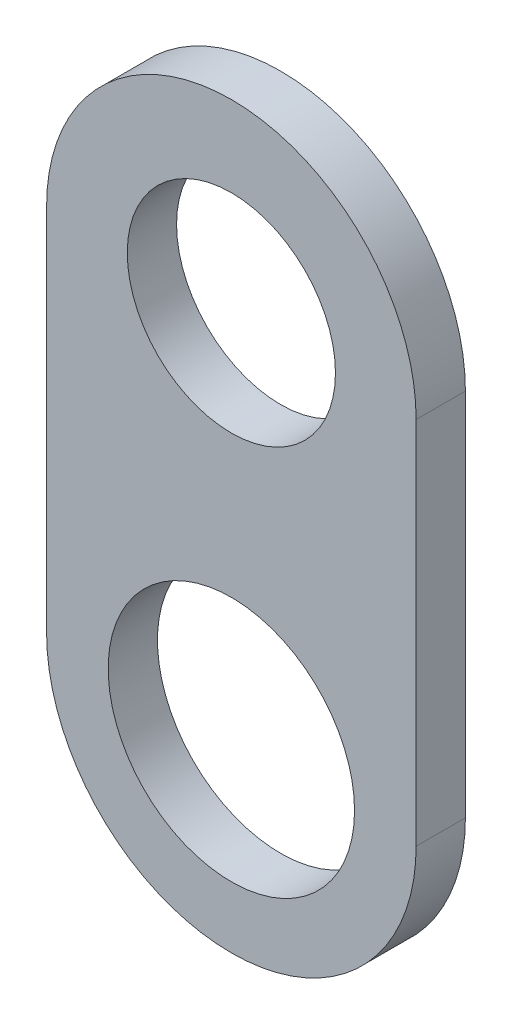
ISO-10303-21;
HEADER;
FILE_DESCRIPTION(('STEP AP214'),'2;1');
FILE_NAME('part.step','',(''),(''),'','','');
FILE_SCHEMA(('AUTOMOTIVE_DESIGN { 1 0 10303 214 1 1 1 1 }'));
ENDSEC;
DATA;
#1=APPLICATION_CONTEXT('core data for automotive mechanical design processes');
#2=APPLICATION_PROTOCOL_DEFINITION('international standard','automotive_design',2000,#1);
#3=PRODUCT_CONTEXT('',#1,'mechanical');
#4=PRODUCT('Part','Part','',(#3));
#5=PRODUCT_RELATED_PRODUCT_CATEGORY('part','',(#4));
#6=PRODUCT_DEFINITION_FORMATION('','',#4);
#7=PRODUCT_DEFINITION_CONTEXT('part definition',#1,'design');
#8=PRODUCT_DEFINITION('design','',#6,#7);
#9=PRODUCT_DEFINITION_SHAPE('','',#8);
#10=(LENGTH_UNIT() NAMED_UNIT(*) SI_UNIT(.MILLI.,.METRE.));
#11=(NAMED_UNIT(*) PLANE_ANGLE_UNIT() SI_UNIT($,.RADIAN.));
#12=(NAMED_UNIT(*) SI_UNIT($,.STERADIAN.) SOLID_ANGLE_UNIT());
#13=UNCERTAINTY_MEASURE_WITH_UNIT(LENGTH_MEASURE(1.E-05),#10,'distance_accuracy_value','');
#14=(GEOMETRIC_REPRESENTATION_CONTEXT(3) GLOBAL_UNCERTAINTY_ASSIGNED_CONTEXT((#13)) GLOBAL_UNIT_ASSIGNED_CONTEXT((#10,
#11,#12)) REPRESENTATION_CONTEXT('',''));
#15=CARTESIAN_POINT('',(0.,0.,0.));
#16=DIRECTION('',(0.,0.,1.));
#17=DIRECTION('',(1.,0.,0.));
#18=AXIS2_PLACEMENT_3D('',#15,#16,#17);
#19=CARTESIAN_POINT('',(0.,-38.1,5.08));
#20=DIRECTION('',(0.,0.,1.));
#21=DIRECTION('',(1.,0.,0.));
#22=AXIS2_PLACEMENT_3D('',#19,#20,#21);
#23=PLANE('',#22);
#24=CARTESIAN_POINT('',(0.,0.,5.08));
#25=DIRECTION('',(0.,0.,1.));
#26=DIRECTION('',(1.,0.,0.));
#27=AXIS2_PLACEMENT_3D('',#24,#25,#26);
#28=CIRCLE('',#27,10.7315);
#29=CARTESIAN_POINT('',(10.7315,0.,5.08));
#30=VERTEX_POINT('',#29);
#31=EDGE_CURVE('E131',#30,#30,#28,.T.);
#32=ORIENTED_EDGE('',*,*,#31,.F.);
#33=EDGE_LOOP('',(#32));
#34=FACE_BOUND('',#33,.T.);
#35=CARTESIAN_POINT('',(0.,-38.1,5.08));
#36=DIRECTION('',(0.,0.,1.));
#37=DIRECTION('',(1.,0.,0.));
#38=AXIS2_PLACEMENT_3D('',#35,#36,#37);
#39=CIRCLE('',#38,19.05);
#40=CARTESIAN_POINT('',(-19.05,-38.1,5.08));
#41=VERTEX_POINT('',#40);
#42=CARTESIAN_POINT('',(19.05,-38.1,5.08));
#43=VERTEX_POINT('',#42);
#44=EDGE_CURVE('E107',#41,#43,#39,.T.);
#45=ORIENTED_EDGE('',*,*,#44,.T.);
#46=DIRECTION('',(0.,1.,0.));
#47=VECTOR('',#46,1.);
#48=CARTESIAN_POINT('',(19.05,-38.1,5.08));
#49=LINE('',#48,#47);
#50=CARTESIAN_POINT('',(19.05,0.,5.08));
#51=VERTEX_POINT('',#50);
#52=EDGE_CURVE('E103',#43,#51,#49,.T.);
#53=ORIENTED_EDGE('',*,*,#52,.T.);
#54=CARTESIAN_POINT('',(0.,0.,5.08));
#55=DIRECTION('',(0.,0.,1.));
#56=DIRECTION('',(1.,0.,0.));
#57=AXIS2_PLACEMENT_3D('',#54,#55,#56);
#58=CIRCLE('',#57,19.05);
#59=CARTESIAN_POINT('',(-19.05,0.,5.08));
#60=VERTEX_POINT('',#59);
#61=EDGE_CURVE('E106',#51,#60,#58,.T.);
#62=ORIENTED_EDGE('',*,*,#61,.T.);
#63=DIRECTION('',(0.,-1.,0.));
#64=VECTOR('',#63,1.);
#65=CARTESIAN_POINT('',(-19.05,-38.1,5.08));
#66=LINE('',#65,#64);
#67=EDGE_CURVE('E75',#60,#41,#66,.T.);
#68=ORIENTED_EDGE('',*,*,#67,.T.);
#69=EDGE_LOOP('',(#45,#53,#62,#68));
#70=FACE_BOUND('',#69,.T.);
#71=CARTESIAN_POINT('',(0.,-38.1,5.08));
#72=DIRECTION('',(0.,0.,1.));
#73=DIRECTION('',(1.,0.,0.));
#74=AXIS2_PLACEMENT_3D('',#71,#72,#73);
#75=CIRCLE('',#74,12.7);
#76=CARTESIAN_POINT('',(12.7,-38.1,5.08));
#77=VERTEX_POINT('',#76);
#78=EDGE_CURVE('E152',#77,#77,#75,.T.);
#79=ORIENTED_EDGE('',*,*,#78,.F.);
#80=EDGE_LOOP('',(#79));
#81=FACE_BOUND('',#80,.T.);
#82=ADVANCED_FACE('F60',(#34,#70,#81),#23,.T.);
#83=CARTESIAN_POINT('',(0.,-38.1,0.));
#84=DIRECTION('',(0.,0.,1.));
#85=DIRECTION('',(1.,0.,0.));
#86=AXIS2_PLACEMENT_3D('',#83,#84,#85);
#87=PLANE('',#86);
#88=CARTESIAN_POINT('',(0.,-38.1,0.));
#89=DIRECTION('',(0.,0.,1.));
#90=DIRECTION('',(1.,0.,0.));
#91=AXIS2_PLACEMENT_3D('',#88,#89,#90);
#92=CIRCLE('',#91,19.05);
#93=CARTESIAN_POINT('',(-19.05,-38.1,0.));
#94=VERTEX_POINT('',#93);
#95=CARTESIAN_POINT('',(19.05,-38.1,0.));
#96=VERTEX_POINT('',#95);
#97=EDGE_CURVE('E130',#94,#96,#92,.T.);
#98=ORIENTED_EDGE('',*,*,#97,.F.);
#99=DIRECTION('',(0.,-1.,0.));
#100=VECTOR('',#99,1.);
#101=CARTESIAN_POINT('',(-19.05,-38.1,0.));
#102=LINE('',#101,#100);
#103=CARTESIAN_POINT('',(-19.05,0.,0.));
#104=VERTEX_POINT('',#103);
#105=EDGE_CURVE('E97',#104,#94,#102,.T.);
#106=ORIENTED_EDGE('',*,*,#105,.F.);
#107=CARTESIAN_POINT('',(0.,0.,0.));
#108=DIRECTION('',(0.,0.,1.));
#109=DIRECTION('',(1.,0.,0.));
#110=AXIS2_PLACEMENT_3D('',#107,#108,#109);
#111=CIRCLE('',#110,19.05);
#112=CARTESIAN_POINT('',(19.05,0.,0.));
#113=VERTEX_POINT('',#112);
#114=EDGE_CURVE('E95',#113,#104,#111,.T.);
#115=ORIENTED_EDGE('',*,*,#114,.F.);
#116=DIRECTION('',(0.,1.,0.));
#117=VECTOR('',#116,1.);
#118=CARTESIAN_POINT('',(19.05,-38.1,0.));
#119=LINE('',#118,#117);
#120=EDGE_CURVE('E113',#96,#113,#119,.T.);
#121=ORIENTED_EDGE('',*,*,#120,.F.);
#122=EDGE_LOOP('',(#98,#106,#115,#121));
#123=FACE_BOUND('',#122,.T.);
#124=CARTESIAN_POINT('',(0.,0.,0.));
#125=DIRECTION('',(0.,0.,1.));
#126=DIRECTION('',(1.,0.,0.));
#127=AXIS2_PLACEMENT_3D('',#124,#125,#126);
#128=CIRCLE('',#127,10.7315);
#129=CARTESIAN_POINT('',(10.7315,0.,0.));
#130=VERTEX_POINT('',#129);
#131=EDGE_CURVE('E153',#130,#130,#128,.T.);
#132=ORIENTED_EDGE('',*,*,#131,.T.);
#133=EDGE_LOOP('',(#132));
#134=FACE_BOUND('',#133,.T.);
#135=CARTESIAN_POINT('',(0.,-38.1,0.));
#136=DIRECTION('',(0.,0.,1.));
#137=DIRECTION('',(1.,0.,0.));
#138=AXIS2_PLACEMENT_3D('',#135,#136,#137);
#139=CIRCLE('',#138,12.7);
#140=CARTESIAN_POINT('',(12.7,-38.1,0.));
#141=VERTEX_POINT('',#140);
#142=EDGE_CURVE('E159',#141,#141,#139,.T.);
#143=ORIENTED_EDGE('',*,*,#142,.T.);
#144=EDGE_LOOP('',(#143));
#145=FACE_BOUND('',#144,.T.);
#146=ADVANCED_FACE('F144',(#123,#134,#145),#87,.F.);
#147=CARTESIAN_POINT('',(0.,-38.1,5.08));
#148=DIRECTION('',(0.,0.,-1.));
#149=DIRECTION('',(-1.,0.,0.));
#150=AXIS2_PLACEMENT_3D('',#147,#148,#149);
#151=CYLINDRICAL_SURFACE('',#150,19.05);
#152=ORIENTED_EDGE('',*,*,#97,.T.);
#153=DIRECTION('',(0.,0.,-1.));
#154=VECTOR('',#153,1.);
#155=CARTESIAN_POINT('',(19.05,-38.1,5.08));
#156=LINE('',#155,#154);
#157=EDGE_CURVE('E12',#43,#96,#156,.T.);
#158=ORIENTED_EDGE('',*,*,#157,.F.);
#159=ORIENTED_EDGE('',*,*,#44,.F.);
#160=DIRECTION('',(0.,0.,-1.));
#161=VECTOR('',#160,1.);
#162=CARTESIAN_POINT('',(-19.05,-38.1,5.08));
#163=LINE('',#162,#161);
#164=EDGE_CURVE('E121',#41,#94,#163,.T.);
#165=ORIENTED_EDGE('',*,*,#164,.T.);
#166=EDGE_LOOP('',(#152,#158,#159,#165));
#167=FACE_BOUND('',#166,.T.);
#168=ADVANCED_FACE('F56',(#167),#151,.T.);
#169=CARTESIAN_POINT('',(19.05,-38.1,5.08));
#170=DIRECTION('',(-1.,0.,0.));
#171=DIRECTION('',(0.,0.,1.));
#172=AXIS2_PLACEMENT_3D('',#169,#170,#171);
#173=PLANE('',#172);
#174=ORIENTED_EDGE('',*,*,#120,.T.);
#175=DIRECTION('',(0.,0.,-1.));
#176=VECTOR('',#175,1.);
#177=CARTESIAN_POINT('',(19.05,0.,5.08));
#178=LINE('',#177,#176);
#179=EDGE_CURVE('E70',#51,#113,#178,.T.);
#180=ORIENTED_EDGE('',*,*,#179,.F.);
#181=ORIENTED_EDGE('',*,*,#52,.F.);
#182=ORIENTED_EDGE('',*,*,#157,.T.);
#183=EDGE_LOOP('',(#174,#180,#181,#182));
#184=FACE_BOUND('',#183,.T.);
#185=ADVANCED_FACE('F114',(#184),#173,.F.);
#186=CARTESIAN_POINT('',(0.,0.,5.08));
#187=DIRECTION('',(0.,0.,-1.));
#188=DIRECTION('',(-1.,0.,0.));
#189=AXIS2_PLACEMENT_3D('',#186,#187,#188);
#190=CYLINDRICAL_SURFACE('',#189,19.05);
#191=ORIENTED_EDGE('',*,*,#114,.T.);
#192=DIRECTION('',(0.,0.,-1.));
#193=VECTOR('',#192,1.);
#194=CARTESIAN_POINT('',(-19.05,0.,5.08));
#195=LINE('',#194,#193);
#196=EDGE_CURVE('E117',#60,#104,#195,.T.);
#197=ORIENTED_EDGE('',*,*,#196,.F.);
#198=ORIENTED_EDGE('',*,*,#61,.F.);
#199=ORIENTED_EDGE('',*,*,#179,.T.);
#200=EDGE_LOOP('',(#191,#197,#198,#199));
#201=FACE_BOUND('',#200,.T.);
#202=ADVANCED_FACE('F119',(#201),#190,.T.);
#203=CARTESIAN_POINT('',(-19.05,-38.1,5.08));
#204=DIRECTION('',(1.,0.,0.));
#205=DIRECTION('',(0.,0.,-1.));
#206=AXIS2_PLACEMENT_3D('',#203,#204,#205);
#207=PLANE('',#206);
#208=ORIENTED_EDGE('',*,*,#105,.T.);
#209=ORIENTED_EDGE('',*,*,#164,.F.);
#210=ORIENTED_EDGE('',*,*,#67,.F.);
#211=ORIENTED_EDGE('',*,*,#196,.T.);
#212=EDGE_LOOP('',(#208,#209,#210,#211));
#213=FACE_BOUND('',#212,.T.);
#214=ADVANCED_FACE('F145',(#213),#207,.F.);
#215=CARTESIAN_POINT('',(0.,0.,5.08));
#216=DIRECTION('',(0.,0.,-1.));
#217=DIRECTION('',(-1.,0.,0.));
#218=AXIS2_PLACEMENT_3D('',#215,#216,#217);
#219=CYLINDRICAL_SURFACE('',#218,10.7315);
#220=ORIENTED_EDGE('',*,*,#31,.T.);
#221=EDGE_LOOP('',(#220));
#222=FACE_BOUND('',#221,.T.);
#223=ORIENTED_EDGE('',*,*,#131,.F.);
#224=EDGE_LOOP('',(#223));
#225=FACE_BOUND('',#224,.T.);
#226=ADVANCED_FACE('F177',(#222,#225),#219,.F.);
#227=CARTESIAN_POINT('',(0.,-38.1,5.08));
#228=DIRECTION('',(0.,0.,-1.));
#229=DIRECTION('',(-1.,0.,0.));
#230=AXIS2_PLACEMENT_3D('',#227,#228,#229);
#231=CYLINDRICAL_SURFACE('',#230,12.7);
#232=ORIENTED_EDGE('',*,*,#78,.T.);
#233=EDGE_LOOP('',(#232));
#234=FACE_BOUND('',#233,.T.);
#235=ORIENTED_EDGE('',*,*,#142,.F.);
#236=EDGE_LOOP('',(#235));
#237=FACE_BOUND('',#236,.T.);
#238=ADVANCED_FACE('F166',(#234,#237),#231,.F.);
#239=CLOSED_SHELL('',(#82,#146,#168,#185,#202,#214,#226,#238));
#240=MANIFOLD_SOLID_BREP('B2',#239);
#241=ADVANCED_BREP_SHAPE_REPRESENTATION('',(#18,#240),#14);
#242=SHAPE_DEFINITION_REPRESENTATION(#9,#241);
ENDSEC;
END-ISO-10303-21;
